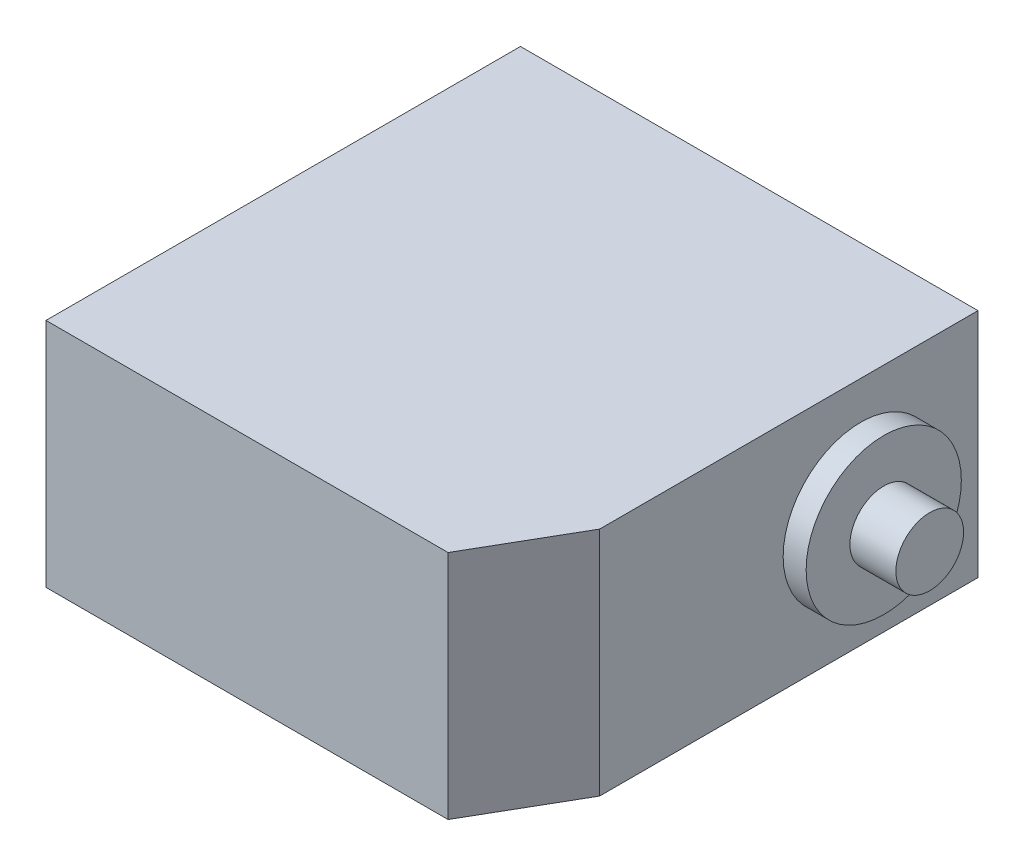
ISO-10303-21;
HEADER;
FILE_DESCRIPTION(('STEP AP214'),'2;1');
FILE_NAME('part.step','',(''),(''),'','','');
FILE_SCHEMA(('AUTOMOTIVE_DESIGN { 1 0 10303 214 1 1 1 1 }'));
ENDSEC;
DATA;
#1=APPLICATION_CONTEXT('core data for automotive mechanical design processes');
#2=APPLICATION_PROTOCOL_DEFINITION('international standard','automotive_design',2000,#1);
#3=PRODUCT_CONTEXT('',#1,'mechanical');
#4=PRODUCT('Part','Part','',(#3));
#5=PRODUCT_RELATED_PRODUCT_CATEGORY('part','',(#4));
#6=PRODUCT_DEFINITION_FORMATION('','',#4);
#7=PRODUCT_DEFINITION_CONTEXT('part definition',#1,'design');
#8=PRODUCT_DEFINITION('design','',#6,#7);
#9=PRODUCT_DEFINITION_SHAPE('','',#8);
#10=(LENGTH_UNIT() NAMED_UNIT(*) SI_UNIT(.MILLI.,.METRE.));
#11=(NAMED_UNIT(*) PLANE_ANGLE_UNIT() SI_UNIT($,.RADIAN.));
#12=(NAMED_UNIT(*) SI_UNIT($,.STERADIAN.) SOLID_ANGLE_UNIT());
#13=UNCERTAINTY_MEASURE_WITH_UNIT(LENGTH_MEASURE(1.E-05),#10,'distance_accuracy_value','');
#14=(GEOMETRIC_REPRESENTATION_CONTEXT(3) GLOBAL_UNCERTAINTY_ASSIGNED_CONTEXT((#13)) GLOBAL_UNIT_ASSIGNED_CONTEXT((#10,
#11,#12)) REPRESENTATION_CONTEXT('',''));
#15=CARTESIAN_POINT('',(0.,0.,0.));
#16=DIRECTION('',(0.,0.,1.));
#17=DIRECTION('',(1.,0.,0.));
#18=AXIS2_PLACEMENT_3D('',#15,#16,#17);
#19=CARTESIAN_POINT('',(19.9009,20.1168,12.2786228026727));
#20=DIRECTION('',(-1.,0.,0.));
#21=DIRECTION('',(0.,0.,1.));
#22=AXIS2_PLACEMENT_3D('',#19,#20,#21);
#23=PLANE('',#22);
#24=CARTESIAN_POINT('',(19.9009,10.0584,-10.4375));
#25=DIRECTION('',(-1.,0.,0.));
#26=DIRECTION('',(0.,0.,1.));
#27=AXIS2_PLACEMENT_3D('',#24,#25,#26);
#28=CIRCLE('',#27,6.75);
#29=CARTESIAN_POINT('',(19.9009,10.0584,-3.6875));
#30=VERTEX_POINT('',#29);
#31=EDGE_CURVE('E40',#30,#30,#28,.F.);
#32=ORIENTED_EDGE('',*,*,#31,.F.);
#33=EDGE_LOOP('',(#32));
#34=FACE_BOUND('',#33,.T.);
#35=DIRECTION('',(0.,0.,-1.));
#36=VECTOR('',#35,1.);
#37=CARTESIAN_POINT('',(19.9009,0.,12.2786228026727));
#38=LINE('',#37,#36);
#39=CARTESIAN_POINT('',(19.9009,0.,12.2786228026727));
#40=VERTEX_POINT('',#39);
#41=CARTESIAN_POINT('',(19.9009,0.,-20.6375));
#42=VERTEX_POINT('',#41);
#43=EDGE_CURVE('E114',#40,#42,#38,.T.);
#44=ORIENTED_EDGE('',*,*,#43,.T.);
#45=DIRECTION('',(0.,-1.,0.));
#46=VECTOR('',#45,1.);
#47=CARTESIAN_POINT('',(19.9009,20.1168,-20.6375));
#48=LINE('',#47,#46);
#49=CARTESIAN_POINT('',(19.9009,20.1168,-20.6375));
#50=VERTEX_POINT('',#49);
#51=EDGE_CURVE('E126',#50,#42,#48,.T.);
#52=ORIENTED_EDGE('',*,*,#51,.F.);
#53=DIRECTION('',(0.,0.,-1.));
#54=VECTOR('',#53,1.);
#55=CARTESIAN_POINT('',(19.9009,20.1168,12.2786228026727));
#56=LINE('',#55,#54);
#57=CARTESIAN_POINT('',(19.9009,20.1168,12.2786228026727));
#58=VERTEX_POINT('',#57);
#59=EDGE_CURVE('E123',#58,#50,#56,.T.);
#60=ORIENTED_EDGE('',*,*,#59,.F.);
#61=DIRECTION('',(0.,-1.,0.));
#62=VECTOR('',#61,1.);
#63=CARTESIAN_POINT('',(19.9009,20.1168,12.2786228026727));
#64=LINE('',#63,#62);
#65=EDGE_CURVE('E110',#58,#40,#64,.T.);
#66=ORIENTED_EDGE('',*,*,#65,.T.);
#67=EDGE_LOOP('',(#44,#52,#60,#66));
#68=FACE_BOUND('',#67,.T.);
#69=ADVANCED_FACE('F37',(#34,#68),#23,.F.);
#70=CARTESIAN_POINT('',(-19.9009,20.1168,-20.6375));
#71=DIRECTION('',(0.,0.,1.));
#72=DIRECTION('',(1.,0.,0.));
#73=AXIS2_PLACEMENT_3D('',#70,#71,#72);
#74=PLANE('',#73);
#75=DIRECTION('',(-1.,0.,0.));
#76=VECTOR('',#75,1.);
#77=CARTESIAN_POINT('',(-19.9009,0.,-20.6375));
#78=LINE('',#77,#76);
#79=CARTESIAN_POINT('',(-19.9009,0.,-20.6375));
#80=VERTEX_POINT('',#79);
#81=EDGE_CURVE('E117',#42,#80,#78,.T.);
#82=ORIENTED_EDGE('',*,*,#81,.T.);
#83=DIRECTION('',(0.,-1.,0.));
#84=VECTOR('',#83,1.);
#85=CARTESIAN_POINT('',(-19.9009,20.1168,-20.6375));
#86=LINE('',#85,#84);
#87=CARTESIAN_POINT('',(-19.9009,20.1168,-20.6375));
#88=VERTEX_POINT('',#87);
#89=EDGE_CURVE('E105',#88,#80,#86,.T.);
#90=ORIENTED_EDGE('',*,*,#89,.F.);
#91=DIRECTION('',(-1.,0.,0.));
#92=VECTOR('',#91,1.);
#93=CARTESIAN_POINT('',(-19.9009,20.1168,-20.6375));
#94=LINE('',#93,#92);
#95=EDGE_CURVE('E89',#50,#88,#94,.T.);
#96=ORIENTED_EDGE('',*,*,#95,.F.);
#97=ORIENTED_EDGE('',*,*,#51,.T.);
#98=EDGE_LOOP('',(#82,#90,#96,#97));
#99=FACE_BOUND('',#98,.T.);
#100=ADVANCED_FACE('F135',(#99),#74,.F.);
#101=CARTESIAN_POINT('',(-19.9009,20.1168,20.6375));
#102=DIRECTION('',(1.,0.,0.));
#103=DIRECTION('',(0.,0.,-1.));
#104=AXIS2_PLACEMENT_3D('',#101,#102,#103);
#105=PLANE('',#104);
#106=DIRECTION('',(0.,0.,1.));
#107=VECTOR('',#106,1.);
#108=CARTESIAN_POINT('',(-19.9009,0.,20.6375));
#109=LINE('',#108,#107);
#110=CARTESIAN_POINT('',(-19.9009,0.,20.6375));
#111=VERTEX_POINT('',#110);
#112=EDGE_CURVE('E104',#80,#111,#109,.T.);
#113=ORIENTED_EDGE('',*,*,#112,.T.);
#114=DIRECTION('',(0.,-1.,0.));
#115=VECTOR('',#114,1.);
#116=CARTESIAN_POINT('',(-19.9009,20.1168,20.6375));
#117=LINE('',#116,#115);
#118=CARTESIAN_POINT('',(-19.9009,20.1168,20.6375));
#119=VERTEX_POINT('',#118);
#120=EDGE_CURVE('E101',#119,#111,#117,.T.);
#121=ORIENTED_EDGE('',*,*,#120,.F.);
#122=DIRECTION('',(0.,0.,1.));
#123=VECTOR('',#122,1.);
#124=CARTESIAN_POINT('',(-19.9009,20.1168,20.6375));
#125=LINE('',#124,#123);
#126=EDGE_CURVE('E93',#88,#119,#125,.T.);
#127=ORIENTED_EDGE('',*,*,#126,.F.);
#128=ORIENTED_EDGE('',*,*,#89,.T.);
#129=EDGE_LOOP('',(#113,#121,#127,#128));
#130=FACE_BOUND('',#129,.T.);
#131=ADVANCED_FACE('F102',(#130),#105,.F.);
#132=CARTESIAN_POINT('',(-19.9009,20.1168,20.6375));
#133=DIRECTION('',(0.,0.,-1.));
#134=DIRECTION('',(-1.,0.,0.));
#135=AXIS2_PLACEMENT_3D('',#132,#133,#134);
#136=PLANE('',#135);
#137=DIRECTION('',(1.,0.,0.));
#138=VECTOR('',#137,1.);
#139=CARTESIAN_POINT('',(-19.9009,0.,20.6375));
#140=LINE('',#139,#138);
#141=CARTESIAN_POINT('',(15.0749,0.,20.6375));
#142=VERTEX_POINT('',#141);
#143=EDGE_CURVE('E74',#111,#142,#140,.T.);
#144=ORIENTED_EDGE('',*,*,#143,.T.);
#145=DIRECTION('',(0.,-1.,0.));
#146=VECTOR('',#145,1.);
#147=CARTESIAN_POINT('',(15.0749,20.1168,20.6375));
#148=LINE('',#147,#146);
#149=CARTESIAN_POINT('',(15.0749,20.1168,20.6375));
#150=VERTEX_POINT('',#149);
#151=EDGE_CURVE('E106',#150,#142,#148,.T.);
#152=ORIENTED_EDGE('',*,*,#151,.F.);
#153=DIRECTION('',(1.,0.,0.));
#154=VECTOR('',#153,1.);
#155=CARTESIAN_POINT('',(-19.9009,20.1168,20.6375));
#156=LINE('',#155,#154);
#157=EDGE_CURVE('E97',#119,#150,#156,.T.);
#158=ORIENTED_EDGE('',*,*,#157,.F.);
#159=ORIENTED_EDGE('',*,*,#120,.T.);
#160=EDGE_LOOP('',(#144,#152,#158,#159));
#161=FACE_BOUND('',#160,.T.);
#162=ADVANCED_FACE('F108',(#161),#136,.F.);
#163=CARTESIAN_POINT('',(19.9009,20.1168,12.2786228026727));
#164=DIRECTION('',(-0.866025403784436,0.,-0.500000000000004));
#165=DIRECTION('',(-0.500000000000004,0.,0.866025403784436));
#166=AXIS2_PLACEMENT_3D('',#163,#164,#165);
#167=PLANE('',#166);
#168=DIRECTION('',(0.500000000000004,0.,-0.866025403784436));
#169=VECTOR('',#168,1.);
#170=CARTESIAN_POINT('',(19.9009,0.,12.2786228026727));
#171=LINE('',#170,#169);
#172=EDGE_CURVE('E80',#142,#40,#171,.T.);
#173=ORIENTED_EDGE('',*,*,#172,.T.);
#174=ORIENTED_EDGE('',*,*,#65,.F.);
#175=DIRECTION('',(0.500000000000004,0.,-0.866025403784436));
#176=VECTOR('',#175,1.);
#177=CARTESIAN_POINT('',(19.9009,20.1168,12.2786228026727));
#178=LINE('',#177,#176);
#179=EDGE_CURVE('E54',#150,#58,#178,.T.);
#180=ORIENTED_EDGE('',*,*,#179,.F.);
#181=ORIENTED_EDGE('',*,*,#151,.T.);
#182=EDGE_LOOP('',(#173,#174,#180,#181));
#183=FACE_BOUND('',#182,.T.);
#184=ADVANCED_FACE('F148',(#183),#167,.F.);
#185=CARTESIAN_POINT('',(0.,20.1168,0.));
#186=DIRECTION('',(0.,-1.,0.));
#187=DIRECTION('',(0.,0.,-1.));
#188=AXIS2_PLACEMENT_3D('',#185,#186,#187);
#189=PLANE('',#188);
#190=ORIENTED_EDGE('',*,*,#59,.T.);
#191=ORIENTED_EDGE('',*,*,#95,.T.);
#192=ORIENTED_EDGE('',*,*,#126,.T.);
#193=ORIENTED_EDGE('',*,*,#157,.T.);
#194=ORIENTED_EDGE('',*,*,#179,.T.);
#195=EDGE_LOOP('',(#190,#191,#192,#193,#194));
#196=FACE_BOUND('',#195,.T.);
#197=ADVANCED_FACE('F95',(#196),#189,.F.);
#198=CARTESIAN_POINT('',(0.,0.,0.));
#199=DIRECTION('',(0.,-1.,0.));
#200=DIRECTION('',(0.,0.,-1.));
#201=AXIS2_PLACEMENT_3D('',#198,#199,#200);
#202=PLANE('',#201);
#203=ORIENTED_EDGE('',*,*,#43,.F.);
#204=ORIENTED_EDGE('',*,*,#172,.F.);
#205=ORIENTED_EDGE('',*,*,#143,.F.);
#206=ORIENTED_EDGE('',*,*,#112,.F.);
#207=ORIENTED_EDGE('',*,*,#81,.F.);
#208=EDGE_LOOP('',(#203,#204,#205,#206,#207));
#209=FACE_BOUND('',#208,.T.);
#210=ADVANCED_FACE('F139',(#209),#202,.T.);
#211=CARTESIAN_POINT('',(21.9009,10.0584,-10.4375));
#212=DIRECTION('',(-1.,0.,0.));
#213=DIRECTION('',(0.,0.,1.));
#214=AXIS2_PLACEMENT_3D('',#211,#212,#213);
#215=CYLINDRICAL_SURFACE('',#214,6.75);
#216=CARTESIAN_POINT('',(21.9009,10.0584,-10.4375));
#217=DIRECTION('',(1.,0.,0.));
#218=DIRECTION('',(0.,0.,-1.));
#219=AXIS2_PLACEMENT_3D('',#216,#217,#218);
#220=CIRCLE('',#219,6.75);
#221=CARTESIAN_POINT('',(21.9009,10.0584,-17.1875));
#222=VERTEX_POINT('',#221);
#223=EDGE_CURVE('E118',#222,#222,#220,.T.);
#224=ORIENTED_EDGE('',*,*,#223,.F.);
#225=EDGE_LOOP('',(#224));
#226=FACE_BOUND('',#225,.T.);
#227=ORIENTED_EDGE('',*,*,#31,.T.);
#228=EDGE_LOOP('',(#227));
#229=FACE_BOUND('',#228,.T.);
#230=ADVANCED_FACE('F131',(#226,#229),#215,.T.);
#231=CARTESIAN_POINT('',(21.9009,10.0584,-10.4375));
#232=DIRECTION('',(1.,0.,0.));
#233=DIRECTION('',(0.,0.,-1.));
#234=AXIS2_PLACEMENT_3D('',#231,#232,#233);
#235=PLANE('',#234);
#236=CARTESIAN_POINT('',(21.9009,10.0584,-10.4375));
#237=DIRECTION('',(1.,0.,0.));
#238=DIRECTION('',(0.,0.,-1.));
#239=AXIS2_PLACEMENT_3D('',#236,#237,#238);
#240=CIRCLE('',#239,2.945);
#241=CARTESIAN_POINT('',(21.9009,10.0584,-13.3825));
#242=VERTEX_POINT('',#241);
#243=EDGE_CURVE('E11',#242,#242,#240,.T.);
#244=ORIENTED_EDGE('',*,*,#243,.F.);
#245=EDGE_LOOP('',(#244));
#246=FACE_BOUND('',#245,.T.);
#247=ORIENTED_EDGE('',*,*,#223,.T.);
#248=EDGE_LOOP('',(#247));
#249=FACE_BOUND('',#248,.T.);
#250=ADVANCED_FACE('F157',(#246,#249),#235,.T.);
#251=CARTESIAN_POINT('',(25.9009,10.0584,-10.4375));
#252=DIRECTION('',(-1.,0.,0.));
#253=DIRECTION('',(0.,0.,1.));
#254=AXIS2_PLACEMENT_3D('',#251,#252,#253);
#255=CYLINDRICAL_SURFACE('',#254,2.945);
#256=CARTESIAN_POINT('',(25.9009,10.0584,-10.4375));
#257=DIRECTION('',(1.,0.,0.));
#258=DIRECTION('',(0.,0.,-1.));
#259=AXIS2_PLACEMENT_3D('',#256,#257,#258);
#260=CIRCLE('',#259,2.945);
#261=CARTESIAN_POINT('',(25.9009,10.0584,-13.3825));
#262=VERTEX_POINT('',#261);
#263=EDGE_CURVE('E173',#262,#262,#260,.T.);
#264=ORIENTED_EDGE('',*,*,#263,.F.);
#265=EDGE_LOOP('',(#264));
#266=FACE_BOUND('',#265,.T.);
#267=ORIENTED_EDGE('',*,*,#243,.T.);
#268=EDGE_LOOP('',(#267));
#269=FACE_BOUND('',#268,.T.);
#270=ADVANCED_FACE('F161',(#266,#269),#255,.T.);
#271=CARTESIAN_POINT('',(25.9009,10.0584,-10.4375));
#272=DIRECTION('',(1.,0.,0.));
#273=DIRECTION('',(0.,0.,-1.));
#274=AXIS2_PLACEMENT_3D('',#271,#272,#273);
#275=PLANE('',#274);
#276=ORIENTED_EDGE('',*,*,#263,.T.);
#277=EDGE_LOOP('',(#276));
#278=FACE_BOUND('',#277,.T.);
#279=ADVANCED_FACE('F165',(#278),#275,.T.);
#280=CLOSED_SHELL('',(#69,#100,#131,#162,#184,#197,#210,#230,#250,#270,#279));
#281=MANIFOLD_SOLID_BREP('B2',#280);
#282=ADVANCED_BREP_SHAPE_REPRESENTATION('',(#18,#281),#14);
#283=SHAPE_DEFINITION_REPRESENTATION(#9,#282);
ENDSEC;
END-ISO-10303-21;
